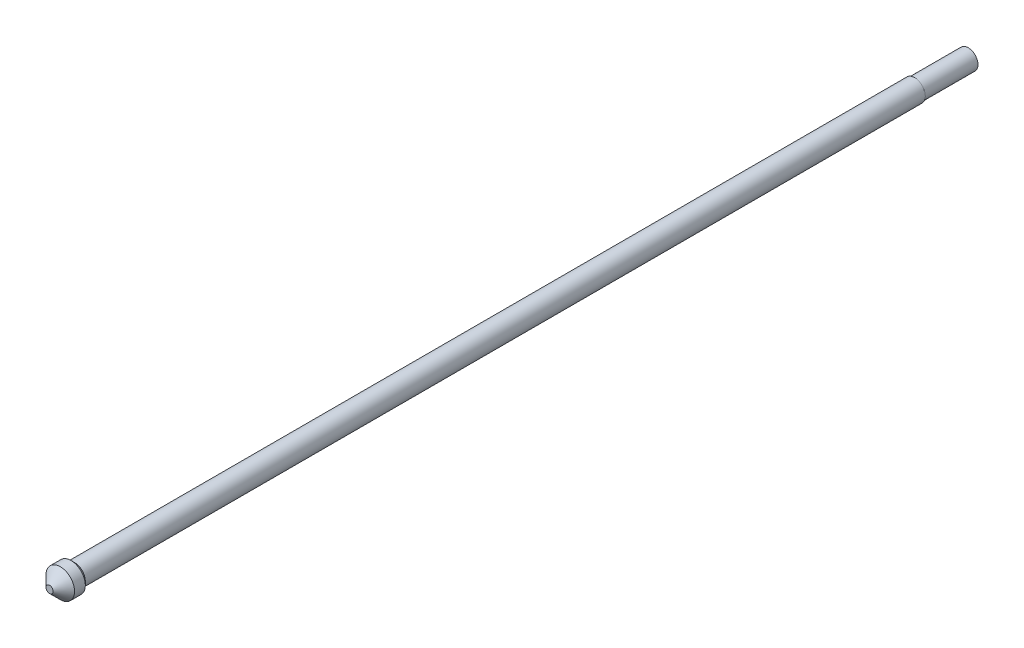
ISO-10303-21;
HEADER;
FILE_DESCRIPTION(('STEP AP214'),'2;1');
FILE_NAME('part.step','',(''),(''),'','','');
FILE_SCHEMA(('AUTOMOTIVE_DESIGN { 1 0 10303 214 1 1 1 1 }'));
ENDSEC;
DATA;
#1=APPLICATION_CONTEXT('core data for automotive mechanical design processes');
#2=APPLICATION_PROTOCOL_DEFINITION('international standard','automotive_design',2000,#1);
#3=PRODUCT_CONTEXT('',#1,'mechanical');
#4=PRODUCT('Part','Part','',(#3));
#5=PRODUCT_RELATED_PRODUCT_CATEGORY('part','',(#4));
#6=PRODUCT_DEFINITION_FORMATION('','',#4);
#7=PRODUCT_DEFINITION_CONTEXT('part definition',#1,'design');
#8=PRODUCT_DEFINITION('design','',#6,#7);
#9=PRODUCT_DEFINITION_SHAPE('','',#8);
#10=(LENGTH_UNIT() NAMED_UNIT(*) SI_UNIT(.MILLI.,.METRE.));
#11=(NAMED_UNIT(*) PLANE_ANGLE_UNIT() SI_UNIT($,.RADIAN.));
#12=(NAMED_UNIT(*) SI_UNIT($,.STERADIAN.) SOLID_ANGLE_UNIT());
#13=UNCERTAINTY_MEASURE_WITH_UNIT(LENGTH_MEASURE(1.E-05),#10,'distance_accuracy_value','');
#14=(GEOMETRIC_REPRESENTATION_CONTEXT(3) GLOBAL_UNCERTAINTY_ASSIGNED_CONTEXT((#13)) GLOBAL_UNIT_ASSIGNED_CONTEXT((#10,
#11,#12)) REPRESENTATION_CONTEXT('',''));
#15=CARTESIAN_POINT('',(0.,0.,0.));
#16=DIRECTION('',(0.,0.,1.));
#17=DIRECTION('',(1.,0.,0.));
#18=AXIS2_PLACEMENT_3D('',#15,#16,#17);
#19=CARTESIAN_POINT('',(0.,0.,257.));
#20=DIRECTION('',(0.,0.,1.));
#21=DIRECTION('',(1.,0.,0.));
#22=AXIS2_PLACEMENT_3D('',#19,#20,#21);
#23=PLANE('',#22);
#24=CARTESIAN_POINT('',(0.,0.,257.));
#25=DIRECTION('',(0.,0.,1.));
#26=DIRECTION('',(1.,0.,0.));
#27=AXIS2_PLACEMENT_3D('',#24,#25,#26);
#28=CIRCLE('',#27,1.);
#29=CARTESIAN_POINT('',(0.,0.999999999990993,256.999999999991));
#30=VERTEX_POINT('',#29);
#31=EDGE_CURVE('E11',#30,#30,#28,.T.);
#32=ORIENTED_EDGE('',*,*,#31,.T.);
#33=EDGE_LOOP('',(#32));
#34=FACE_BOUND('',#33,.T.);
#35=ADVANCED_FACE('F17',(#34),#23,.T.);
#36=CARTESIAN_POINT('',(0.,0.,255.5000000021));
#37=DIRECTION('',(0.,0.,-1.));
#38=DIRECTION('',(0.,-1.,0.));
#39=AXIS2_PLACEMENT_3D('',#36,#37,#38);
#40=CONICAL_SURFACE('',#39,2.499999997882,0.785398163397448);
#41=CARTESIAN_POINT('',(0.,0.,254.));
#42=DIRECTION('',(0.,0.,1.));
#43=DIRECTION('',(-1.,0.,0.));
#44=AXIS2_PLACEMENT_3D('',#41,#42,#43);
#45=CIRCLE('',#44,4.);
#46=CARTESIAN_POINT('',(0.,3.999999999991,253.999999999991));
#47=VERTEX_POINT('',#46);
#48=CARTESIAN_POINT('',(4.,0.,254.));
#49=VERTEX_POINT('',#48);
#50=EDGE_CURVE('E20',#47,#49,#45,.T.);
#51=ORIENTED_EDGE('',*,*,#50,.T.);
#52=CARTESIAN_POINT('',(0.,0.,254.));
#53=DIRECTION('',(0.,0.,1.));
#54=DIRECTION('',(-1.,0.,0.));
#55=AXIS2_PLACEMENT_3D('',#52,#53,#54);
#56=CIRCLE('',#55,4.);
#57=EDGE_CURVE('E115',#49,#47,#56,.T.);
#58=ORIENTED_EDGE('',*,*,#57,.T.);
#59=DIRECTION('',(0.,-0.707106781186548,0.707106781186548));
#60=VECTOR('',#59,1.);
#61=CARTESIAN_POINT('',(0.,2.499999997882,255.5000000021));
#62=LINE('',#61,#60);
#63=EDGE_CURVE('E27',#47,#30,#62,.T.);
#64=ORIENTED_EDGE('',*,*,#63,.T.);
#65=ORIENTED_EDGE('',*,*,#31,.F.);
#66=ORIENTED_EDGE('',*,*,#63,.F.);
#67=EDGE_LOOP('',(#51,#58,#64,#65,#66));
#68=FACE_BOUND('',#67,.T.);
#69=ADVANCED_FACE('F139',(#68),#40,.T.);
#70=CARTESIAN_POINT('',(0.,0.,250.));
#71=DIRECTION('',(0.,0.,1.));
#72=DIRECTION('',(-1.,0.,0.));
#73=AXIS2_PLACEMENT_3D('',#70,#71,#72);
#74=CYLINDRICAL_SURFACE('',#73,4.);
#75=ORIENTED_EDGE('',*,*,#50,.F.);
#76=ORIENTED_EDGE('',*,*,#57,.F.);
#77=DIRECTION('',(0.,0.,-1.));
#78=VECTOR('',#77,1.);
#79=CARTESIAN_POINT('',(4.,0.,250.));
#80=LINE('',#79,#78);
#81=CARTESIAN_POINT('',(4.,0.,251.));
#82=VERTEX_POINT('',#81);
#83=EDGE_CURVE('E72',#49,#82,#80,.T.);
#84=ORIENTED_EDGE('',*,*,#83,.T.);
#85=CARTESIAN_POINT('',(0.,0.,251.));
#86=DIRECTION('',(0.,0.,-1.));
#87=DIRECTION('',(-1.,0.,0.));
#88=AXIS2_PLACEMENT_3D('',#85,#86,#87);
#89=CIRCLE('',#88,4.);
#90=CARTESIAN_POINT('',(0.,3.999999999999,251.));
#91=VERTEX_POINT('',#90);
#92=EDGE_CURVE('E80',#91,#82,#89,.T.);
#93=ORIENTED_EDGE('',*,*,#92,.F.);
#94=CARTESIAN_POINT('',(0.,0.,251.));
#95=DIRECTION('',(0.,0.,-1.));
#96=DIRECTION('',(-1.,0.,0.));
#97=AXIS2_PLACEMENT_3D('',#94,#95,#96);
#98=CIRCLE('',#97,4.);
#99=EDGE_CURVE('E96',#82,#91,#98,.T.);
#100=ORIENTED_EDGE('',*,*,#99,.F.);
#101=ORIENTED_EDGE('',*,*,#83,.F.);
#102=EDGE_LOOP('',(#75,#76,#84,#93,#100,#101));
#103=FACE_BOUND('',#102,.T.);
#104=ADVANCED_FACE('F237',(#103),#74,.T.);
#105=CARTESIAN_POINT('',(0.,0.,250.4999999878));
#106=DIRECTION('',(0.,0.,1.));
#107=DIRECTION('',(0.,-1.,0.));
#108=AXIS2_PLACEMENT_3D('',#105,#106,#107);
#109=CONICAL_SURFACE('',#108,3.499999987798,0.785398163397448);
#110=ORIENTED_EDGE('',*,*,#99,.T.);
#111=DIRECTION('',(0.,-0.707106781186548,-0.707106781186548));
#112=VECTOR('',#111,1.);
#113=CARTESIAN_POINT('',(0.,3.499999987798,250.4999999878));
#114=LINE('',#113,#112);
#115=CARTESIAN_POINT('',(0.,2.99999999999899,250.));
#116=VERTEX_POINT('',#115);
#117=EDGE_CURVE('E63',#91,#116,#114,.T.);
#118=ORIENTED_EDGE('',*,*,#117,.T.);
#119=CARTESIAN_POINT('',(0.,0.,250.));
#120=DIRECTION('',(0.,0.,-1.));
#121=DIRECTION('',(-1.,0.,0.));
#122=AXIS2_PLACEMENT_3D('',#119,#120,#121);
#123=CIRCLE('',#122,3.);
#124=CARTESIAN_POINT('',(-3.,0.,250.));
#125=VERTEX_POINT('',#124);
#126=EDGE_CURVE('E101',#125,#116,#123,.T.);
#127=ORIENTED_EDGE('',*,*,#126,.F.);
#128=CARTESIAN_POINT('',(0.,0.,250.));
#129=DIRECTION('',(0.,0.,-1.));
#130=DIRECTION('',(-1.,0.,0.));
#131=AXIS2_PLACEMENT_3D('',#128,#129,#130);
#132=CIRCLE('',#131,3.);
#133=EDGE_CURVE('E94',#116,#125,#132,.T.);
#134=ORIENTED_EDGE('',*,*,#133,.F.);
#135=ORIENTED_EDGE('',*,*,#117,.F.);
#136=ORIENTED_EDGE('',*,*,#92,.T.);
#137=EDGE_LOOP('',(#110,#118,#127,#134,#135,#136));
#138=FACE_BOUND('',#137,.T.);
#139=ADVANCED_FACE('F228',(#138),#109,.T.);
#140=CARTESIAN_POINT('',(0.,0.,0.));
#141=DIRECTION('',(0.,0.,1.));
#142=DIRECTION('',(1.,0.,0.));
#143=AXIS2_PLACEMENT_3D('',#140,#141,#142);
#144=CYLINDRICAL_SURFACE('',#143,3.);
#145=ORIENTED_EDGE('',*,*,#126,.T.);
#146=ORIENTED_EDGE('',*,*,#133,.T.);
#147=DIRECTION('',(0.,0.,-1.));
#148=VECTOR('',#147,1.);
#149=CARTESIAN_POINT('',(-3.,0.,0.));
#150=LINE('',#149,#148);
#151=CARTESIAN_POINT('',(-3.,0.,15.));
#152=VERTEX_POINT('',#151);
#153=EDGE_CURVE('E89',#125,#152,#150,.T.);
#154=ORIENTED_EDGE('',*,*,#153,.T.);
#155=CARTESIAN_POINT('',(0.,0.,15.));
#156=DIRECTION('',(0.,0.,-1.));
#157=DIRECTION('',(-1.,0.,0.));
#158=AXIS2_PLACEMENT_3D('',#155,#156,#157);
#159=CIRCLE('',#158,3.);
#160=EDGE_CURVE('E93',#152,#152,#159,.T.);
#161=ORIENTED_EDGE('',*,*,#160,.F.);
#162=ORIENTED_EDGE('',*,*,#153,.F.);
#163=EDGE_LOOP('',(#145,#146,#154,#161,#162));
#164=FACE_BOUND('',#163,.T.);
#165=ADVANCED_FACE('F92',(#164),#144,.T.);
#166=CARTESIAN_POINT('',(0.,0.,15.));
#167=DIRECTION('',(0.,0.,-1.));
#168=DIRECTION('',(0.,-1.,0.));
#169=AXIS2_PLACEMENT_3D('',#166,#167,#168);
#170=PLANE('',#169);
#171=CARTESIAN_POINT('',(0.,0.,15.));
#172=DIRECTION('',(0.,0.,1.));
#173=DIRECTION('',(0.,1.,0.));
#174=AXIS2_PLACEMENT_3D('',#171,#172,#173);
#175=CIRCLE('',#174,2.75);
#176=CARTESIAN_POINT('',(0.,-2.75,15.));
#177=VERTEX_POINT('',#176);
#178=EDGE_CURVE('E102',#177,#177,#175,.T.);
#179=ORIENTED_EDGE('',*,*,#178,.T.);
#180=EDGE_LOOP('',(#179));
#181=FACE_BOUND('',#180,.T.);
#182=ORIENTED_EDGE('',*,*,#160,.T.);
#183=EDGE_LOOP('',(#182));
#184=FACE_BOUND('',#183,.T.);
#185=ADVANCED_FACE('F99',(#181,#184),#170,.T.);
#186=CARTESIAN_POINT('',(0.,0.,0.));
#187=DIRECTION('',(0.,0.,-1.));
#188=DIRECTION('',(0.,1.,0.));
#189=AXIS2_PLACEMENT_3D('',#186,#187,#188);
#190=CYLINDRICAL_SURFACE('',#189,2.75);
#191=CARTESIAN_POINT('',(0.,0.,0.));
#192=DIRECTION('',(0.,0.,-1.));
#193=DIRECTION('',(0.,-1.,0.));
#194=AXIS2_PLACEMENT_3D('',#191,#192,#193);
#195=CIRCLE('',#194,2.75);
#196=CARTESIAN_POINT('',(0.,-2.75,0.));
#197=VERTEX_POINT('',#196);
#198=EDGE_CURVE('E119',#197,#197,#195,.T.);
#199=ORIENTED_EDGE('',*,*,#198,.F.);
#200=DIRECTION('',(0.,0.,1.));
#201=VECTOR('',#200,1.);
#202=CARTESIAN_POINT('',(0.,-2.75,0.));
#203=LINE('',#202,#201);
#204=EDGE_CURVE('E110',#197,#177,#203,.T.);
#205=ORIENTED_EDGE('',*,*,#204,.T.);
#206=ORIENTED_EDGE('',*,*,#178,.F.);
#207=ORIENTED_EDGE('',*,*,#204,.F.);
#208=EDGE_LOOP('',(#199,#205,#206,#207));
#209=FACE_BOUND('',#208,.T.);
#210=ADVANCED_FACE('F194',(#209),#190,.T.);
#211=CARTESIAN_POINT('',(0.,0.,0.));
#212=DIRECTION('',(0.,0.,1.));
#213=DIRECTION('',(1.,0.,0.));
#214=AXIS2_PLACEMENT_3D('',#211,#212,#213);
#215=PLANE('',#214);
#216=ORIENTED_EDGE('',*,*,#198,.T.);
#217=EDGE_LOOP('',(#216));
#218=FACE_BOUND('',#217,.T.);
#219=ADVANCED_FACE('F188',(#218),#215,.F.);
#220=CLOSED_SHELL('',(#35,#69,#104,#139,#165,#185,#210,#219));
#221=MANIFOLD_SOLID_BREP('B1',#220);
#222=ADVANCED_BREP_SHAPE_REPRESENTATION('',(#18,#221),#14);
#223=SHAPE_DEFINITION_REPRESENTATION(#9,#222);
ENDSEC;
END-ISO-10303-21;
